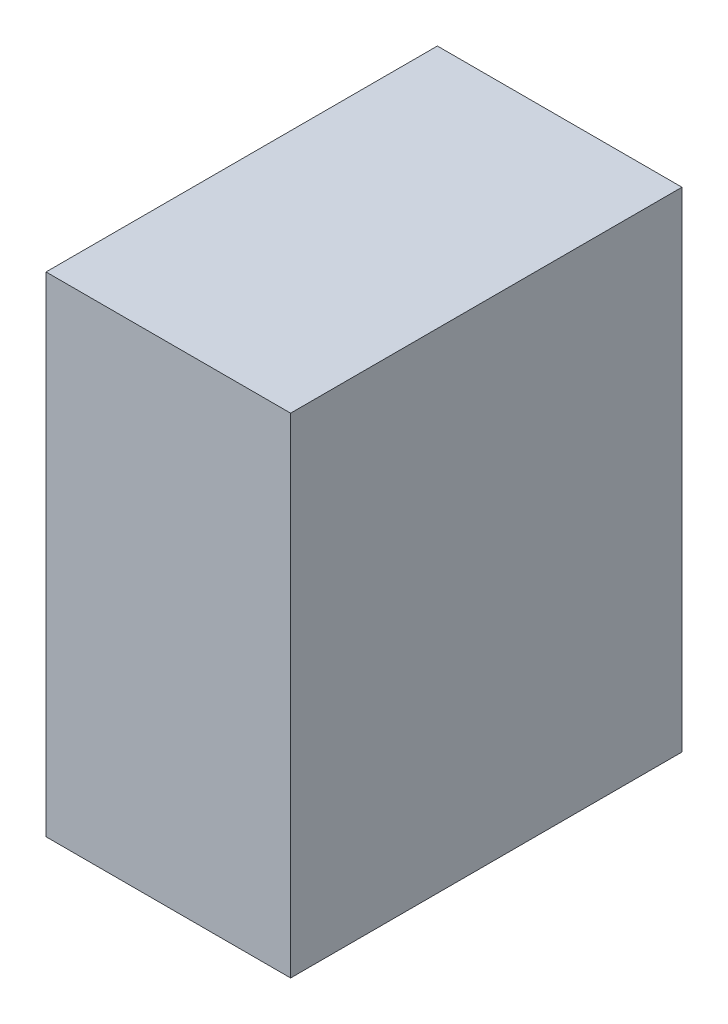
ISO-10303-21;
HEADER;
FILE_DESCRIPTION(('STEP AP214'),'2;1');
FILE_NAME('part.step','',(''),(''),'','','');
FILE_SCHEMA(('AUTOMOTIVE_DESIGN { 1 0 10303 214 1 1 1 1 }'));
ENDSEC;
DATA;
#1=APPLICATION_CONTEXT('core data for automotive mechanical design processes');
#2=APPLICATION_PROTOCOL_DEFINITION('international standard','automotive_design',2000,#1);
#3=PRODUCT_CONTEXT('',#1,'mechanical');
#4=PRODUCT('Part','Part','',(#3));
#5=PRODUCT_RELATED_PRODUCT_CATEGORY('part','',(#4));
#6=PRODUCT_DEFINITION_FORMATION('','',#4);
#7=PRODUCT_DEFINITION_CONTEXT('part definition',#1,'design');
#8=PRODUCT_DEFINITION('design','',#6,#7);
#9=PRODUCT_DEFINITION_SHAPE('','',#8);
#10=(LENGTH_UNIT() NAMED_UNIT(*) SI_UNIT(.MILLI.,.METRE.));
#11=(NAMED_UNIT(*) PLANE_ANGLE_UNIT() SI_UNIT($,.RADIAN.));
#12=(NAMED_UNIT(*) SI_UNIT($,.STERADIAN.) SOLID_ANGLE_UNIT());
#13=UNCERTAINTY_MEASURE_WITH_UNIT(LENGTH_MEASURE(1.E-05),#10,'distance_accuracy_value','');
#14=(GEOMETRIC_REPRESENTATION_CONTEXT(3) GLOBAL_UNCERTAINTY_ASSIGNED_CONTEXT((#13)) GLOBAL_UNIT_ASSIGNED_CONTEXT((#10,
#11,#12)) REPRESENTATION_CONTEXT('',''));
#15=CARTESIAN_POINT('',(0.,0.,0.));
#16=DIRECTION('',(0.,0.,1.));
#17=DIRECTION('',(1.,0.,0.));
#18=AXIS2_PLACEMENT_3D('',#15,#16,#17);
#19=CARTESIAN_POINT('',(0.,0.,0.4));
#20=DIRECTION('',(0.,1.,0.));
#21=DIRECTION('',(0.,0.,1.));
#22=AXIS2_PLACEMENT_3D('',#19,#20,#21);
#23=PLANE('',#22);
#24=DIRECTION('',(1.,0.,0.));
#25=VECTOR('',#24,1.);
#26=CARTESIAN_POINT('',(0.,0.,0.));
#27=LINE('',#26,#25);
#28=CARTESIAN_POINT('',(0.,0.,0.));
#29=VERTEX_POINT('',#28);
#30=CARTESIAN_POINT('',(0.25,0.,0.));
#31=VERTEX_POINT('',#30);
#32=EDGE_CURVE('E97',#29,#31,#27,.T.);
#33=ORIENTED_EDGE('',*,*,#32,.T.);
#34=DIRECTION('',(0.,0.,-1.));
#35=VECTOR('',#34,1.);
#36=CARTESIAN_POINT('',(0.25,0.,0.4));
#37=LINE('',#36,#35);
#38=CARTESIAN_POINT('',(0.25,0.,0.4));
#39=VERTEX_POINT('',#38);
#40=EDGE_CURVE('E11',#39,#31,#37,.T.);
#41=ORIENTED_EDGE('',*,*,#40,.F.);
#42=DIRECTION('',(1.,0.,0.));
#43=VECTOR('',#42,1.);
#44=CARTESIAN_POINT('',(0.,0.,0.4));
#45=LINE('',#44,#43);
#46=CARTESIAN_POINT('',(0.,0.,0.4));
#47=VERTEX_POINT('',#46);
#48=EDGE_CURVE('E83',#47,#39,#45,.T.);
#49=ORIENTED_EDGE('',*,*,#48,.F.);
#50=DIRECTION('',(0.,0.,-1.));
#51=VECTOR('',#50,1.);
#52=CARTESIAN_POINT('',(0.,0.,0.4));
#53=LINE('',#52,#51);
#54=EDGE_CURVE('E50',#47,#29,#53,.T.);
#55=ORIENTED_EDGE('',*,*,#54,.T.);
#56=EDGE_LOOP('',(#33,#41,#49,#55));
#57=FACE_BOUND('',#56,.T.);
#58=ADVANCED_FACE('F34',(#57),#23,.F.);
#59=CARTESIAN_POINT('',(0.25,0.,0.4));
#60=DIRECTION('',(-1.,0.,0.));
#61=DIRECTION('',(0.,0.,1.));
#62=AXIS2_PLACEMENT_3D('',#59,#60,#61);
#63=PLANE('',#62);
#64=DIRECTION('',(0.,1.,0.));
#65=VECTOR('',#64,1.);
#66=CARTESIAN_POINT('',(0.25,0.,0.));
#67=LINE('',#66,#65);
#68=CARTESIAN_POINT('',(0.25,0.5,0.));
#69=VERTEX_POINT('',#68);
#70=EDGE_CURVE('E88',#31,#69,#67,.T.);
#71=ORIENTED_EDGE('',*,*,#70,.T.);
#72=DIRECTION('',(0.,0.,-1.));
#73=VECTOR('',#72,1.);
#74=CARTESIAN_POINT('',(0.25,0.5,0.4));
#75=LINE('',#74,#73);
#76=CARTESIAN_POINT('',(0.25,0.5,0.4));
#77=VERTEX_POINT('',#76);
#78=EDGE_CURVE('E42',#77,#69,#75,.T.);
#79=ORIENTED_EDGE('',*,*,#78,.F.);
#80=DIRECTION('',(0.,1.,0.));
#81=VECTOR('',#80,1.);
#82=CARTESIAN_POINT('',(0.25,0.,0.4));
#83=LINE('',#82,#81);
#84=EDGE_CURVE('E75',#39,#77,#83,.T.);
#85=ORIENTED_EDGE('',*,*,#84,.F.);
#86=ORIENTED_EDGE('',*,*,#40,.T.);
#87=EDGE_LOOP('',(#71,#79,#85,#86));
#88=FACE_BOUND('',#87,.T.);
#89=ADVANCED_FACE('F87',(#88),#63,.F.);
#90=CARTESIAN_POINT('',(0.,0.5,0.4));
#91=DIRECTION('',(0.,1.,0.));
#92=DIRECTION('',(0.,0.,1.));
#93=AXIS2_PLACEMENT_3D('',#90,#91,#92);
#94=PLANE('',#93);
#95=DIRECTION('',(1.,0.,0.));
#96=VECTOR('',#95,1.);
#97=CARTESIAN_POINT('',(0.,0.5,0.));
#98=LINE('',#97,#96);
#99=CARTESIAN_POINT('',(0.,0.5,0.));
#100=VERTEX_POINT('',#99);
#101=EDGE_CURVE('E100',#100,#69,#98,.T.);
#102=ORIENTED_EDGE('',*,*,#101,.F.);
#103=DIRECTION('',(0.,0.,-1.));
#104=VECTOR('',#103,1.);
#105=CARTESIAN_POINT('',(0.,0.5,0.4));
#106=LINE('',#105,#104);
#107=CARTESIAN_POINT('',(0.,0.5,0.4));
#108=VERTEX_POINT('',#107);
#109=EDGE_CURVE('E64',#108,#100,#106,.T.);
#110=ORIENTED_EDGE('',*,*,#109,.F.);
#111=DIRECTION('',(1.,0.,0.));
#112=VECTOR('',#111,1.);
#113=CARTESIAN_POINT('',(0.,0.5,0.4));
#114=LINE('',#113,#112);
#115=EDGE_CURVE('E82',#108,#77,#114,.T.);
#116=ORIENTED_EDGE('',*,*,#115,.T.);
#117=ORIENTED_EDGE('',*,*,#78,.T.);
#118=EDGE_LOOP('',(#102,#110,#116,#117));
#119=FACE_BOUND('',#118,.T.);
#120=ADVANCED_FACE('F91',(#119),#94,.T.);
#121=CARTESIAN_POINT('',(0.,0.,0.4));
#122=DIRECTION('',(-1.,0.,0.));
#123=DIRECTION('',(0.,0.,1.));
#124=AXIS2_PLACEMENT_3D('',#121,#122,#123);
#125=PLANE('',#124);
#126=DIRECTION('',(0.,1.,0.));
#127=VECTOR('',#126,1.);
#128=CARTESIAN_POINT('',(0.,0.,0.));
#129=LINE('',#128,#127);
#130=EDGE_CURVE('E102',#29,#100,#129,.T.);
#131=ORIENTED_EDGE('',*,*,#130,.F.);
#132=ORIENTED_EDGE('',*,*,#54,.F.);
#133=DIRECTION('',(0.,1.,0.));
#134=VECTOR('',#133,1.);
#135=CARTESIAN_POINT('',(0.,0.,0.4));
#136=LINE('',#135,#134);
#137=EDGE_CURVE('E92',#47,#108,#136,.T.);
#138=ORIENTED_EDGE('',*,*,#137,.T.);
#139=ORIENTED_EDGE('',*,*,#109,.T.);
#140=EDGE_LOOP('',(#131,#132,#138,#139));
#141=FACE_BOUND('',#140,.T.);
#142=ADVANCED_FACE('F108',(#141),#125,.T.);
#143=CARTESIAN_POINT('',(0.,0.,0.4));
#144=DIRECTION('',(0.,0.,1.));
#145=DIRECTION('',(1.,0.,0.));
#146=AXIS2_PLACEMENT_3D('',#143,#144,#145);
#147=PLANE('',#146);
#148=ORIENTED_EDGE('',*,*,#48,.T.);
#149=ORIENTED_EDGE('',*,*,#84,.T.);
#150=ORIENTED_EDGE('',*,*,#115,.F.);
#151=ORIENTED_EDGE('',*,*,#137,.F.);
#152=EDGE_LOOP('',(#148,#149,#150,#151));
#153=FACE_BOUND('',#152,.T.);
#154=ADVANCED_FACE('F79',(#153),#147,.T.);
#155=CARTESIAN_POINT('',(0.,0.,0.));
#156=DIRECTION('',(0.,0.,1.));
#157=DIRECTION('',(1.,0.,0.));
#158=AXIS2_PLACEMENT_3D('',#155,#156,#157);
#159=PLANE('',#158);
#160=ORIENTED_EDGE('',*,*,#32,.F.);
#161=ORIENTED_EDGE('',*,*,#130,.T.);
#162=ORIENTED_EDGE('',*,*,#101,.T.);
#163=ORIENTED_EDGE('',*,*,#70,.F.);
#164=EDGE_LOOP('',(#160,#161,#162,#163));
#165=FACE_BOUND('',#164,.T.);
#166=ADVANCED_FACE('F107',(#165),#159,.F.);
#167=CLOSED_SHELL('',(#58,#89,#120,#142,#154,#166));
#168=MANIFOLD_SOLID_BREP('B2',#167);
#169=ADVANCED_BREP_SHAPE_REPRESENTATION('',(#18,#168),#14);
#170=SHAPE_DEFINITION_REPRESENTATION(#9,#169);
ENDSEC;
END-ISO-10303-21;
